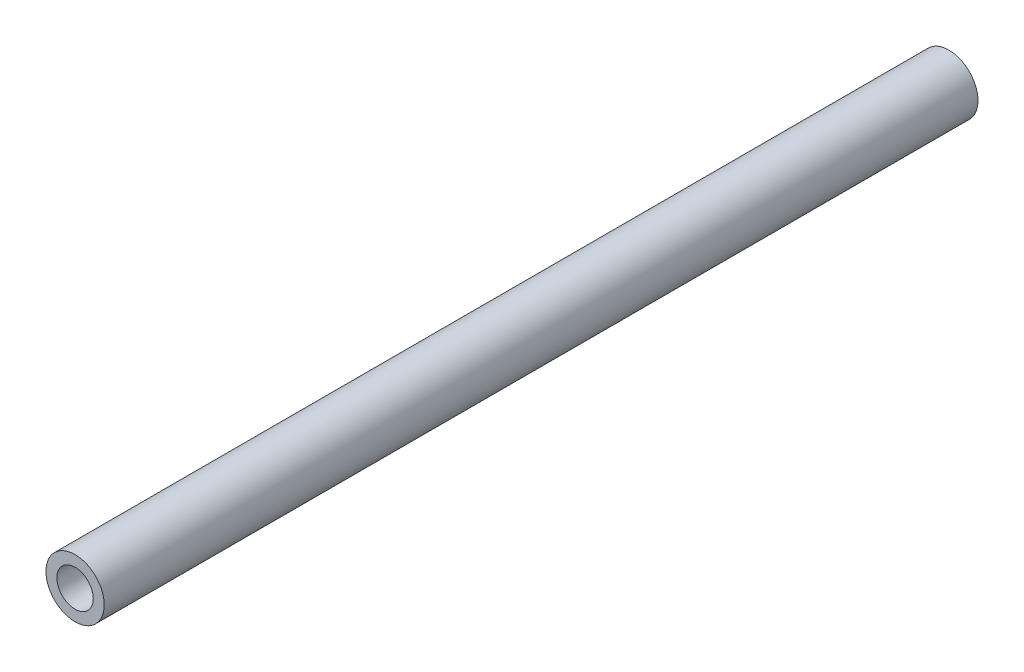
ISO-10303-21;
HEADER;
FILE_DESCRIPTION(('STEP AP214'),'2;1');
FILE_NAME('part.step','',(''),(''),'','','');
FILE_SCHEMA(('AUTOMOTIVE_DESIGN { 1 0 10303 214 1 1 1 1 }'));
ENDSEC;
DATA;
#1=APPLICATION_CONTEXT('core data for automotive mechanical design processes');
#2=APPLICATION_PROTOCOL_DEFINITION('international standard','automotive_design',2000,#1);
#3=PRODUCT_CONTEXT('',#1,'mechanical');
#4=PRODUCT('Part','Part','',(#3));
#5=PRODUCT_RELATED_PRODUCT_CATEGORY('part','',(#4));
#6=PRODUCT_DEFINITION_FORMATION('','',#4);
#7=PRODUCT_DEFINITION_CONTEXT('part definition',#1,'design');
#8=PRODUCT_DEFINITION('design','',#6,#7);
#9=PRODUCT_DEFINITION_SHAPE('','',#8);
#10=(LENGTH_UNIT() NAMED_UNIT(*) SI_UNIT(.MILLI.,.METRE.));
#11=(NAMED_UNIT(*) PLANE_ANGLE_UNIT() SI_UNIT($,.RADIAN.));
#12=(NAMED_UNIT(*) SI_UNIT($,.STERADIAN.) SOLID_ANGLE_UNIT());
#13=UNCERTAINTY_MEASURE_WITH_UNIT(LENGTH_MEASURE(1.E-05),#10,'distance_accuracy_value','');
#14=(GEOMETRIC_REPRESENTATION_CONTEXT(3) GLOBAL_UNCERTAINTY_ASSIGNED_CONTEXT((#13)) GLOBAL_UNIT_ASSIGNED_CONTEXT((#10,
#11,#12)) REPRESENTATION_CONTEXT('',''));
#15=CARTESIAN_POINT('',(0.,0.,0.));
#16=DIRECTION('',(0.,0.,1.));
#17=DIRECTION('',(1.,0.,0.));
#18=AXIS2_PLACEMENT_3D('',#15,#16,#17);
#19=CARTESIAN_POINT('',(0.,0.,120.));
#20=DIRECTION('',(0.,0.,-1.));
#21=DIRECTION('',(-1.,0.,0.));
#22=AXIS2_PLACEMENT_3D('',#19,#20,#21);
#23=CYLINDRICAL_SURFACE('',#22,4.);
#24=CARTESIAN_POINT('',(0.,0.,80.));
#25=DIRECTION('',(0.,0.,1.));
#26=DIRECTION('',(1.,0.,0.));
#27=AXIS2_PLACEMENT_3D('',#24,#25,#26);
#28=CIRCLE('',#27,4.);
#29=CARTESIAN_POINT('',(4.,0.,80.));
#30=VERTEX_POINT('',#29);
#31=EDGE_CURVE('E54',#30,#30,#28,.T.);
#32=ORIENTED_EDGE('',*,*,#31,.T.);
#33=EDGE_LOOP('',(#32));
#34=FACE_BOUND('',#33,.T.);
#35=CARTESIAN_POINT('',(0.,0.,-90.));
#36=DIRECTION('',(0.,0.,-1.));
#37=DIRECTION('',(-1.,0.,0.));
#38=AXIS2_PLACEMENT_3D('',#35,#36,#37);
#39=CIRCLE('',#38,4.);
#40=CARTESIAN_POINT('',(-4.,0.,-90.));
#41=VERTEX_POINT('',#40);
#42=EDGE_CURVE('E43',#41,#41,#39,.T.);
#43=ORIENTED_EDGE('',*,*,#42,.T.);
#44=EDGE_LOOP('',(#43));
#45=FACE_BOUND('',#44,.T.);
#46=ADVANCED_FACE('F39',(#34,#45),#23,.F.);
#47=CARTESIAN_POINT('',(0.,0.,120.));
#48=DIRECTION('',(0.,0.,1.));
#49=DIRECTION('',(1.,0.,0.));
#50=AXIS2_PLACEMENT_3D('',#47,#48,#49);
#51=PLANE('',#50);
#52=CARTESIAN_POINT('',(0.,0.,120.));
#53=DIRECTION('',(0.,0.,1.));
#54=DIRECTION('',(1.,0.,0.));
#55=AXIS2_PLACEMENT_3D('',#52,#53,#54);
#56=CIRCLE('',#55,5.);
#57=CARTESIAN_POINT('',(5.,0.,120.));
#58=VERTEX_POINT('',#57);
#59=EDGE_CURVE('E57',#58,#58,#56,.T.);
#60=ORIENTED_EDGE('',*,*,#59,.F.);
#61=EDGE_LOOP('',(#60));
#62=FACE_BOUND('',#61,.T.);
#63=CARTESIAN_POINT('',(0.,0.,120.));
#64=DIRECTION('',(0.,0.,1.));
#65=DIRECTION('',(1.,0.,0.));
#66=AXIS2_PLACEMENT_3D('',#63,#64,#65);
#67=CIRCLE('',#66,8.);
#68=CARTESIAN_POINT('',(8.,0.,120.));
#69=VERTEX_POINT('',#68);
#70=EDGE_CURVE('E10',#69,#69,#67,.T.);
#71=ORIENTED_EDGE('',*,*,#70,.T.);
#72=EDGE_LOOP('',(#71));
#73=FACE_BOUND('',#72,.T.);
#74=ADVANCED_FACE('F96',(#62,#73),#51,.T.);
#75=CARTESIAN_POINT('',(0.,0.,-120.));
#76=DIRECTION('',(0.,0.,1.));
#77=DIRECTION('',(1.,0.,0.));
#78=AXIS2_PLACEMENT_3D('',#75,#76,#77);
#79=PLANE('',#78);
#80=CARTESIAN_POINT('',(0.,0.,-120.));
#81=DIRECTION('',(0.,0.,-1.));
#82=DIRECTION('',(-1.,0.,0.));
#83=AXIS2_PLACEMENT_3D('',#80,#81,#82);
#84=CIRCLE('',#83,5.);
#85=CARTESIAN_POINT('',(-5.,0.,-120.));
#86=VERTEX_POINT('',#85);
#87=EDGE_CURVE('E71',#86,#86,#84,.T.);
#88=ORIENTED_EDGE('',*,*,#87,.F.);
#89=EDGE_LOOP('',(#88));
#90=FACE_BOUND('',#89,.T.);
#91=CARTESIAN_POINT('',(0.,0.,-120.));
#92=DIRECTION('',(0.,0.,1.));
#93=DIRECTION('',(1.,0.,0.));
#94=AXIS2_PLACEMENT_3D('',#91,#92,#93);
#95=CIRCLE('',#94,8.);
#96=CARTESIAN_POINT('',(8.,0.,-120.));
#97=VERTEX_POINT('',#96);
#98=EDGE_CURVE('E48',#97,#97,#95,.T.);
#99=ORIENTED_EDGE('',*,*,#98,.F.);
#100=EDGE_LOOP('',(#99));
#101=FACE_BOUND('',#100,.T.);
#102=ADVANCED_FACE('F101',(#90,#101),#79,.F.);
#103=CARTESIAN_POINT('',(0.,0.,120.));
#104=DIRECTION('',(0.,0.,-1.));
#105=DIRECTION('',(-1.,0.,0.));
#106=AXIS2_PLACEMENT_3D('',#103,#104,#105);
#107=CYLINDRICAL_SURFACE('',#106,8.);
#108=ORIENTED_EDGE('',*,*,#70,.F.);
#109=EDGE_LOOP('',(#108));
#110=FACE_BOUND('',#109,.T.);
#111=ORIENTED_EDGE('',*,*,#98,.T.);
#112=EDGE_LOOP('',(#111));
#113=FACE_BOUND('',#112,.T.);
#114=ADVANCED_FACE('F41',(#110,#113),#107,.T.);
#115=CARTESIAN_POINT('',(0.,0.,80.));
#116=DIRECTION('',(0.,0.,1.));
#117=DIRECTION('',(1.,0.,0.));
#118=AXIS2_PLACEMENT_3D('',#115,#116,#117);
#119=CYLINDRICAL_SURFACE('',#118,5.);
#120=CARTESIAN_POINT('',(0.,0.,80.));
#121=DIRECTION('',(0.,0.,1.));
#122=DIRECTION('',(1.,0.,0.));
#123=AXIS2_PLACEMENT_3D('',#120,#121,#122);
#124=CIRCLE('',#123,5.);
#125=CARTESIAN_POINT('',(5.,0.,80.));
#126=VERTEX_POINT('',#125);
#127=EDGE_CURVE('E61',#126,#126,#124,.T.);
#128=ORIENTED_EDGE('',*,*,#127,.F.);
#129=EDGE_LOOP('',(#128));
#130=FACE_BOUND('',#129,.T.);
#131=ORIENTED_EDGE('',*,*,#59,.T.);
#132=EDGE_LOOP('',(#131));
#133=FACE_BOUND('',#132,.T.);
#134=ADVANCED_FACE('F105',(#130,#133),#119,.F.);
#135=CARTESIAN_POINT('',(0.,0.,80.));
#136=DIRECTION('',(0.,0.,1.));
#137=DIRECTION('',(1.,0.,0.));
#138=AXIS2_PLACEMENT_3D('',#135,#136,#137);
#139=PLANE('',#138);
#140=ORIENTED_EDGE('',*,*,#31,.F.);
#141=EDGE_LOOP('',(#140));
#142=FACE_BOUND('',#141,.T.);
#143=ORIENTED_EDGE('',*,*,#127,.T.);
#144=EDGE_LOOP('',(#143));
#145=FACE_BOUND('',#144,.T.);
#146=ADVANCED_FACE('F92',(#142,#145),#139,.T.);
#147=CARTESIAN_POINT('',(0.,0.,-90.));
#148=DIRECTION('',(0.,0.,-1.));
#149=DIRECTION('',(-1.,0.,0.));
#150=AXIS2_PLACEMENT_3D('',#147,#148,#149);
#151=CYLINDRICAL_SURFACE('',#150,5.);
#152=CARTESIAN_POINT('',(0.,0.,-90.));
#153=DIRECTION('',(0.,0.,-1.));
#154=DIRECTION('',(-1.,0.,0.));
#155=AXIS2_PLACEMENT_3D('',#152,#153,#154);
#156=CIRCLE('',#155,5.);
#157=CARTESIAN_POINT('',(-5.,0.,-90.));
#158=VERTEX_POINT('',#157);
#159=EDGE_CURVE('E75',#158,#158,#156,.T.);
#160=ORIENTED_EDGE('',*,*,#159,.F.);
#161=EDGE_LOOP('',(#160));
#162=FACE_BOUND('',#161,.T.);
#163=ORIENTED_EDGE('',*,*,#87,.T.);
#164=EDGE_LOOP('',(#163));
#165=FACE_BOUND('',#164,.T.);
#166=ADVANCED_FACE('F87',(#162,#165),#151,.F.);
#167=CARTESIAN_POINT('',(0.,0.,-90.));
#168=DIRECTION('',(0.,0.,-1.));
#169=DIRECTION('',(-1.,0.,0.));
#170=AXIS2_PLACEMENT_3D('',#167,#168,#169);
#171=PLANE('',#170);
#172=ORIENTED_EDGE('',*,*,#42,.F.);
#173=EDGE_LOOP('',(#172));
#174=FACE_BOUND('',#173,.T.);
#175=ORIENTED_EDGE('',*,*,#159,.T.);
#176=EDGE_LOOP('',(#175));
#177=FACE_BOUND('',#176,.T.);
#178=ADVANCED_FACE('F85',(#174,#177),#171,.T.);
#179=CLOSED_SHELL('',(#46,#74,#102,#114,#134,#146,#166,#178));
#180=MANIFOLD_SOLID_BREP('B2',#179);
#181=ADVANCED_BREP_SHAPE_REPRESENTATION('',(#18,#180),#14);
#182=SHAPE_DEFINITION_REPRESENTATION(#9,#181);
ENDSEC;
END-ISO-10303-21;
